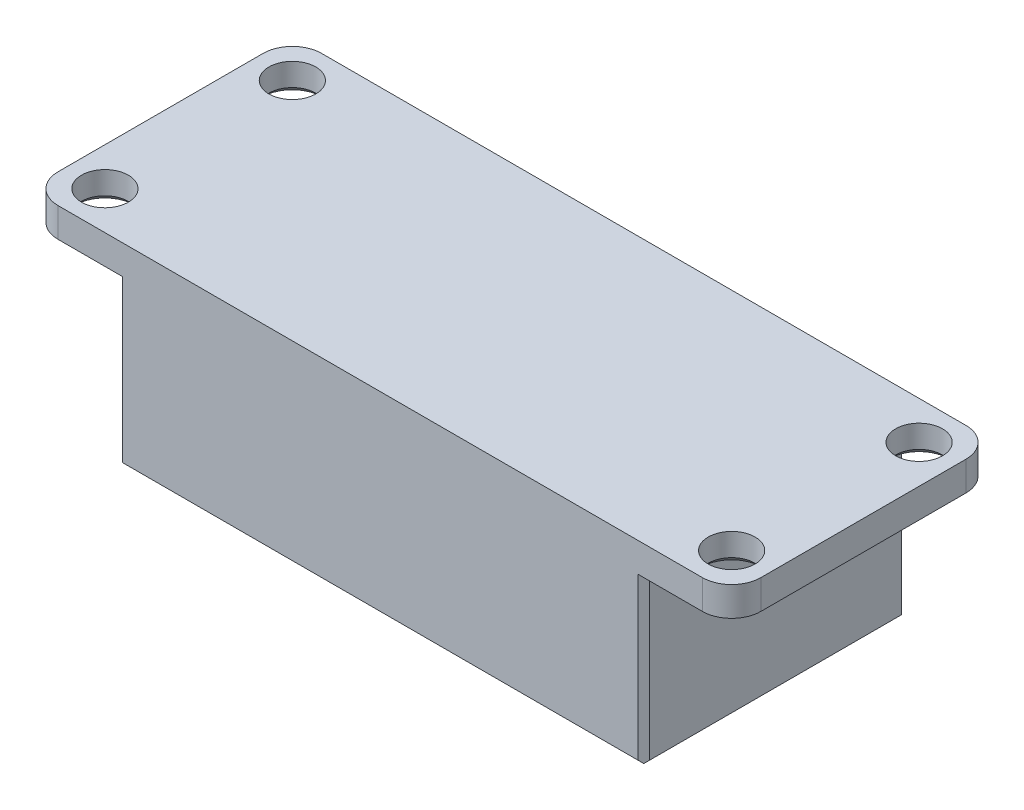
ISO-10303-21;
HEADER;
FILE_DESCRIPTION(('STEP AP214'),'2;1');
FILE_NAME('part.step','',(''),(''),'','','');
FILE_SCHEMA(('AUTOMOTIVE_DESIGN { 1 0 10303 214 1 1 1 1 }'));
ENDSEC;
DATA;
#1=APPLICATION_CONTEXT('core data for automotive mechanical design processes');
#2=APPLICATION_PROTOCOL_DEFINITION('international standard','automotive_design',2000,#1);
#3=PRODUCT_CONTEXT('',#1,'mechanical');
#4=PRODUCT('Part','Part','',(#3));
#5=PRODUCT_RELATED_PRODUCT_CATEGORY('part','',(#4));
#6=PRODUCT_DEFINITION_FORMATION('','',#4);
#7=PRODUCT_DEFINITION_CONTEXT('part definition',#1,'design');
#8=PRODUCT_DEFINITION('design','',#6,#7);
#9=PRODUCT_DEFINITION_SHAPE('','',#8);
#10=(LENGTH_UNIT() NAMED_UNIT(*) SI_UNIT(.MILLI.,.METRE.));
#11=(NAMED_UNIT(*) PLANE_ANGLE_UNIT() SI_UNIT($,.RADIAN.));
#12=(NAMED_UNIT(*) SI_UNIT($,.STERADIAN.) SOLID_ANGLE_UNIT());
#13=UNCERTAINTY_MEASURE_WITH_UNIT(LENGTH_MEASURE(1.E-05),#10,'distance_accuracy_value','');
#14=(GEOMETRIC_REPRESENTATION_CONTEXT(3) GLOBAL_UNCERTAINTY_ASSIGNED_CONTEXT((#13)) GLOBAL_UNIT_ASSIGNED_CONTEXT((#10,
#11,#12)) REPRESENTATION_CONTEXT('',''));
#15=CARTESIAN_POINT('',(0.,0.,0.));
#16=DIRECTION('',(0.,0.,1.));
#17=DIRECTION('',(1.,0.,0.));
#18=AXIS2_PLACEMENT_3D('',#15,#16,#17);
#19=CARTESIAN_POINT('',(-9.,6.,-4.5));
#20=DIRECTION('',(1.,0.,0.));
#21=DIRECTION('',(0.,0.,-1.));
#22=AXIS2_PLACEMENT_3D('',#19,#20,#21);
#23=PLANE('',#22);
#24=DIRECTION('',(0.,0.,1.));
#25=VECTOR('',#24,1.);
#26=CARTESIAN_POINT('',(-9.,6.,-4.5));
#27=LINE('',#26,#25);
#28=CARTESIAN_POINT('',(-9.,6.,-4.3));
#29=VERTEX_POINT('',#28);
#30=CARTESIAN_POINT('',(-9.,6.,4.3));
#31=VERTEX_POINT('',#30);
#32=EDGE_CURVE('E208',#29,#31,#27,.T.);
#33=ORIENTED_EDGE('',*,*,#32,.F.);
#34=DIRECTION('',(0.,-1.,0.));
#35=VECTOR('',#34,1.);
#36=CARTESIAN_POINT('',(-9.,0.500000000000007,-4.3));
#37=LINE('',#36,#35);
#38=CARTESIAN_POINT('',(-9.,0.500000000000007,-4.3));
#39=VERTEX_POINT('',#38);
#40=EDGE_CURVE('E269',#29,#39,#37,.T.);
#41=ORIENTED_EDGE('',*,*,#40,.T.);
#42=DIRECTION('',(0.,0.,1.));
#43=VECTOR('',#42,1.);
#44=CARTESIAN_POINT('',(-9.,0.500000000000007,-4.5));
#45=LINE('',#44,#43);
#46=CARTESIAN_POINT('',(-9.,0.500000000000007,4.3));
#47=VERTEX_POINT('',#46);
#48=EDGE_CURVE('E253',#39,#47,#45,.T.);
#49=ORIENTED_EDGE('',*,*,#48,.T.);
#50=DIRECTION('',(0.,1.,0.));
#51=VECTOR('',#50,1.);
#52=CARTESIAN_POINT('',(-9.,6.,4.3));
#53=LINE('',#52,#51);
#54=EDGE_CURVE('E256',#47,#31,#53,.T.);
#55=ORIENTED_EDGE('',*,*,#54,.T.);
#56=EDGE_LOOP('',(#33,#41,#49,#55));
#57=FACE_BOUND('',#56,.T.);
#58=ADVANCED_FACE('F36',(#57),#23,.F.);
#59=CARTESIAN_POINT('',(-9.,6.,4.5));
#60=DIRECTION('',(0.,0.,-1.));
#61=DIRECTION('',(-1.,0.,0.));
#62=AXIS2_PLACEMENT_3D('',#59,#60,#61);
#63=PLANE('',#62);
#64=DIRECTION('',(1.,0.,0.));
#65=VECTOR('',#64,1.);
#66=CARTESIAN_POINT('',(12.,6.,4.5));
#67=LINE('',#66,#65);
#68=CARTESIAN_POINT('',(-11.,6.,4.5));
#69=VERTEX_POINT('',#68);
#70=CARTESIAN_POINT('',(-8.8,6.,4.5));
#71=VERTEX_POINT('',#70);
#72=EDGE_CURVE('E309',#69,#71,#67,.T.);
#73=ORIENTED_EDGE('',*,*,#72,.T.);
#74=DIRECTION('',(0.,-1.,0.));
#75=VECTOR('',#74,1.);
#76=CARTESIAN_POINT('',(-8.8,6.,4.5));
#77=LINE('',#76,#75);
#78=CARTESIAN_POINT('',(-8.8,0.500000000000007,4.5));
#79=VERTEX_POINT('',#78);
#80=EDGE_CURVE('E287',#71,#79,#77,.T.);
#81=ORIENTED_EDGE('',*,*,#80,.T.);
#82=DIRECTION('',(1.,0.,0.));
#83=VECTOR('',#82,1.);
#84=CARTESIAN_POINT('',(-9.,0.500000000000007,4.5));
#85=LINE('',#84,#83);
#86=CARTESIAN_POINT('',(8.8,0.500000000000007,4.5));
#87=VERTEX_POINT('',#86);
#88=EDGE_CURVE('E236',#79,#87,#85,.T.);
#89=ORIENTED_EDGE('',*,*,#88,.T.);
#90=DIRECTION('',(0.,1.,0.));
#91=VECTOR('',#90,1.);
#92=CARTESIAN_POINT('',(8.8,6.,4.5));
#93=LINE('',#92,#91);
#94=CARTESIAN_POINT('',(8.8,6.,4.5));
#95=VERTEX_POINT('',#94);
#96=EDGE_CURVE('E284',#87,#95,#93,.T.);
#97=ORIENTED_EDGE('',*,*,#96,.T.);
#98=CARTESIAN_POINT('',(11.,6.,4.5));
#99=VERTEX_POINT('',#98);
#100=EDGE_CURVE('E329',#95,#99,#67,.T.);
#101=ORIENTED_EDGE('',*,*,#100,.T.);
#102=DIRECTION('',(0.,-1.,0.));
#103=VECTOR('',#102,1.);
#104=CARTESIAN_POINT('',(11.,6.,4.5));
#105=LINE('',#104,#103);
#106=CARTESIAN_POINT('',(11.,7.,4.5));
#107=VERTEX_POINT('',#106);
#108=EDGE_CURVE('E185',#99,#107,#105,.F.);
#109=ORIENTED_EDGE('',*,*,#108,.T.);
#110=DIRECTION('',(1.,0.,0.));
#111=VECTOR('',#110,1.);
#112=CARTESIAN_POINT('',(12.,7.,4.5));
#113=LINE('',#112,#111);
#114=CARTESIAN_POINT('',(-11.,7.,4.5));
#115=VERTEX_POINT('',#114);
#116=EDGE_CURVE('E344',#115,#107,#113,.T.);
#117=ORIENTED_EDGE('',*,*,#116,.F.);
#118=DIRECTION('',(0.,-1.,0.));
#119=VECTOR('',#118,1.);
#120=CARTESIAN_POINT('',(-11.,6.,4.5));
#121=LINE('',#120,#119);
#122=EDGE_CURVE('E227',#115,#69,#121,.T.);
#123=ORIENTED_EDGE('',*,*,#122,.T.);
#124=EDGE_LOOP('',(#73,#81,#89,#97,#101,#109,#117,#123));
#125=FACE_BOUND('',#124,.T.);
#126=ADVANCED_FACE('F317',(#125),#63,.F.);
#127=CARTESIAN_POINT('',(9.,6.,-4.5));
#128=DIRECTION('',(1.,0.,0.));
#129=DIRECTION('',(0.,0.,-1.));
#130=AXIS2_PLACEMENT_3D('',#127,#128,#129);
#131=PLANE('',#130);
#132=DIRECTION('',(0.,0.,1.));
#133=VECTOR('',#132,1.);
#134=CARTESIAN_POINT('',(9.,6.,-4.5));
#135=LINE('',#134,#133);
#136=CARTESIAN_POINT('',(9.,6.,-4.3));
#137=VERTEX_POINT('',#136);
#138=CARTESIAN_POINT('',(9.,6.,4.3));
#139=VERTEX_POINT('',#138);
#140=EDGE_CURVE('E203',#137,#139,#135,.T.);
#141=ORIENTED_EDGE('',*,*,#140,.T.);
#142=DIRECTION('',(0.,-1.,0.));
#143=VECTOR('',#142,1.);
#144=CARTESIAN_POINT('',(9.,0.500000000000007,4.3));
#145=LINE('',#144,#143);
#146=CARTESIAN_POINT('',(9.,0.500000000000007,4.3));
#147=VERTEX_POINT('',#146);
#148=EDGE_CURVE('E295',#139,#147,#145,.T.);
#149=ORIENTED_EDGE('',*,*,#148,.T.);
#150=DIRECTION('',(0.,0.,-1.));
#151=VECTOR('',#150,1.);
#152=CARTESIAN_POINT('',(9.,0.500000000000007,-4.5));
#153=LINE('',#152,#151);
#154=CARTESIAN_POINT('',(9.,0.500000000000007,-4.3));
#155=VERTEX_POINT('',#154);
#156=EDGE_CURVE('E249',#147,#155,#153,.T.);
#157=ORIENTED_EDGE('',*,*,#156,.T.);
#158=DIRECTION('',(0.,1.,0.));
#159=VECTOR('',#158,1.);
#160=CARTESIAN_POINT('',(9.,6.,-4.3));
#161=LINE('',#160,#159);
#162=EDGE_CURVE('E57',#155,#137,#161,.T.);
#163=ORIENTED_EDGE('',*,*,#162,.T.);
#164=EDGE_LOOP('',(#141,#149,#157,#163));
#165=FACE_BOUND('',#164,.T.);
#166=ADVANCED_FACE('F430',(#165),#131,.T.);
#167=CARTESIAN_POINT('',(-9.,6.,-4.5));
#168=DIRECTION('',(0.,0.,-1.));
#169=DIRECTION('',(-1.,0.,0.));
#170=AXIS2_PLACEMENT_3D('',#167,#168,#169);
#171=PLANE('',#170);
#172=DIRECTION('',(-1.,0.,0.));
#173=VECTOR('',#172,1.);
#174=CARTESIAN_POINT('',(-9.,0.500000000000007,-4.5));
#175=LINE('',#174,#173);
#176=CARTESIAN_POINT('',(8.8,0.500000000000007,-4.5));
#177=VERTEX_POINT('',#176);
#178=CARTESIAN_POINT('',(-8.8,0.500000000000007,-4.5));
#179=VERTEX_POINT('',#178);
#180=EDGE_CURVE('E251',#177,#179,#175,.T.);
#181=ORIENTED_EDGE('',*,*,#180,.T.);
#182=DIRECTION('',(0.,1.,0.));
#183=VECTOR('',#182,1.);
#184=CARTESIAN_POINT('',(-8.8,6.,-4.5));
#185=LINE('',#184,#183);
#186=CARTESIAN_POINT('',(-8.8,6.,-4.5));
#187=VERTEX_POINT('',#186);
#188=EDGE_CURVE('E194',#179,#187,#185,.T.);
#189=ORIENTED_EDGE('',*,*,#188,.T.);
#190=DIRECTION('',(-1.,0.,0.));
#191=VECTOR('',#190,1.);
#192=CARTESIAN_POINT('',(12.,6.,-4.5));
#193=LINE('',#192,#191);
#194=CARTESIAN_POINT('',(-11.,6.,-4.5));
#195=VERTEX_POINT('',#194);
#196=EDGE_CURVE('E176',#187,#195,#193,.T.);
#197=ORIENTED_EDGE('',*,*,#196,.T.);
#198=DIRECTION('',(0.,-1.,0.));
#199=VECTOR('',#198,1.);
#200=CARTESIAN_POINT('',(-11.,7.,-4.5));
#201=LINE('',#200,#199);
#202=CARTESIAN_POINT('',(-11.,7.,-4.5));
#203=VERTEX_POINT('',#202);
#204=EDGE_CURVE('E191',#195,#203,#201,.F.);
#205=ORIENTED_EDGE('',*,*,#204,.T.);
#206=DIRECTION('',(-1.,0.,0.));
#207=VECTOR('',#206,1.);
#208=CARTESIAN_POINT('',(12.,7.,-4.5));
#209=LINE('',#208,#207);
#210=CARTESIAN_POINT('',(11.,7.,-4.5));
#211=VERTEX_POINT('',#210);
#212=EDGE_CURVE('E350',#211,#203,#209,.T.);
#213=ORIENTED_EDGE('',*,*,#212,.F.);
#214=DIRECTION('',(0.,-1.,0.));
#215=VECTOR('',#214,1.);
#216=CARTESIAN_POINT('',(11.,6.,-4.5));
#217=LINE('',#216,#215);
#218=CARTESIAN_POINT('',(11.,6.,-4.5));
#219=VERTEX_POINT('',#218);
#220=EDGE_CURVE('E202',#211,#219,#217,.T.);
#221=ORIENTED_EDGE('',*,*,#220,.T.);
#222=CARTESIAN_POINT('',(8.8,6.,-4.5));
#223=VERTEX_POINT('',#222);
#224=EDGE_CURVE('E196',#219,#223,#193,.T.);
#225=ORIENTED_EDGE('',*,*,#224,.T.);
#226=DIRECTION('',(0.,-1.,0.));
#227=VECTOR('',#226,1.);
#228=CARTESIAN_POINT('',(8.8,6.,-4.5));
#229=LINE('',#228,#227);
#230=EDGE_CURVE('E280',#223,#177,#229,.T.);
#231=ORIENTED_EDGE('',*,*,#230,.T.);
#232=EDGE_LOOP('',(#181,#189,#197,#205,#213,#221,#225,#231));
#233=FACE_BOUND('',#232,.T.);
#234=ADVANCED_FACE('F189',(#233),#171,.T.);
#235=CARTESIAN_POINT('',(0.,0.,0.));
#236=DIRECTION('',(0.,1.,0.));
#237=DIRECTION('',(0.,0.,1.));
#238=AXIS2_PLACEMENT_3D('',#235,#236,#237);
#239=PLANE('',#238);
#240=DIRECTION('',(0.,0.,1.));
#241=VECTOR('',#240,1.);
#242=CARTESIAN_POINT('',(8.49999999999999,0.,4.5));
#243=LINE('',#242,#241);
#244=CARTESIAN_POINT('',(8.49999999999999,0.,-3.99999999999999));
#245=VERTEX_POINT('',#244);
#246=CARTESIAN_POINT('',(8.49999999999999,0.,3.99999999999999));
#247=VERTEX_POINT('',#246);
#248=EDGE_CURVE('E244',#245,#247,#243,.T.);
#249=ORIENTED_EDGE('',*,*,#248,.T.);
#250=DIRECTION('',(-1.,0.,0.));
#251=VECTOR('',#250,1.);
#252=CARTESIAN_POINT('',(0.,0.,3.99999999999999));
#253=LINE('',#252,#251);
#254=CARTESIAN_POINT('',(-8.49999999999999,0.,3.99999999999999));
#255=VERTEX_POINT('',#254);
#256=EDGE_CURVE('E246',#247,#255,#253,.T.);
#257=ORIENTED_EDGE('',*,*,#256,.T.);
#258=DIRECTION('',(0.,0.,-1.));
#259=VECTOR('',#258,1.);
#260=CARTESIAN_POINT('',(-8.49999999999999,0.,0.));
#261=LINE('',#260,#259);
#262=CARTESIAN_POINT('',(-8.49999999999999,0.,-3.99999999999999));
#263=VERTEX_POINT('',#262);
#264=EDGE_CURVE('E239',#255,#263,#261,.T.);
#265=ORIENTED_EDGE('',*,*,#264,.T.);
#266=DIRECTION('',(1.,0.,0.));
#267=VECTOR('',#266,1.);
#268=CARTESIAN_POINT('',(9.,0.,-3.99999999999999));
#269=LINE('',#268,#267);
#270=EDGE_CURVE('E242',#263,#245,#269,.T.);
#271=ORIENTED_EDGE('',*,*,#270,.T.);
#272=EDGE_LOOP('',(#249,#257,#265,#271));
#273=FACE_BOUND('',#272,.T.);
#274=ADVANCED_FACE('F490',(#273),#239,.F.);
#275=CARTESIAN_POINT('',(0.,6.,0.));
#276=DIRECTION('',(0.,-1.,0.));
#277=DIRECTION('',(0.,0.,-1.));
#278=AXIS2_PLACEMENT_3D('',#275,#276,#277);
#279=PLANE('',#278);
#280=CARTESIAN_POINT('',(10.7,6.,3.2));
#281=DIRECTION('',(0.,-1.,0.));
#282=DIRECTION('',(0.,0.,-1.));
#283=AXIS2_PLACEMENT_3D('',#280,#281,#282);
#284=CIRCLE('',#283,1.025);
#285=CARTESIAN_POINT('',(10.7,6.,2.175));
#286=VERTEX_POINT('',#285);
#287=EDGE_CURVE('E377',#286,#286,#284,.T.);
#288=ORIENTED_EDGE('',*,*,#287,.F.);
#289=EDGE_LOOP('',(#288));
#290=FACE_BOUND('',#289,.T.);
#291=CARTESIAN_POINT('',(10.7,6.,-3.2));
#292=DIRECTION('',(0.,-1.,0.));
#293=DIRECTION('',(0.,0.,-1.));
#294=AXIS2_PLACEMENT_3D('',#291,#292,#293);
#295=CIRCLE('',#294,1.025);
#296=CARTESIAN_POINT('',(10.7,6.,-4.225));
#297=VERTEX_POINT('',#296);
#298=EDGE_CURVE('E368',#297,#297,#295,.T.);
#299=ORIENTED_EDGE('',*,*,#298,.F.);
#300=EDGE_LOOP('',(#299));
#301=FACE_BOUND('',#300,.T.);
#302=ORIENTED_EDGE('',*,*,#224,.F.);
#303=CARTESIAN_POINT('',(11.,6.,-3.5));
#304=DIRECTION('',(0.,-1.,0.));
#305=DIRECTION('',(0.,0.,-1.));
#306=AXIS2_PLACEMENT_3D('',#303,#304,#305);
#307=CIRCLE('',#306,1.);
#308=CARTESIAN_POINT('',(12.,6.,-3.5));
#309=VERTEX_POINT('',#308);
#310=EDGE_CURVE('E213',#219,#309,#307,.T.);
#311=ORIENTED_EDGE('',*,*,#310,.T.);
#312=DIRECTION('',(0.,0.,-1.));
#313=VECTOR('',#312,1.);
#314=CARTESIAN_POINT('',(12.,6.,-4.5));
#315=LINE('',#314,#313);
#316=CARTESIAN_POINT('',(12.,6.,3.5));
#317=VERTEX_POINT('',#316);
#318=EDGE_CURVE('E197',#317,#309,#315,.T.);
#319=ORIENTED_EDGE('',*,*,#318,.F.);
#320=CARTESIAN_POINT('',(11.,6.,3.5));
#321=DIRECTION('',(0.,-1.,0.));
#322=DIRECTION('',(0.,0.,-1.));
#323=AXIS2_PLACEMENT_3D('',#320,#321,#322);
#324=CIRCLE('',#323,1.);
#325=EDGE_CURVE('E206',#317,#99,#324,.T.);
#326=ORIENTED_EDGE('',*,*,#325,.T.);
#327=ORIENTED_EDGE('',*,*,#100,.F.);
#328=DIRECTION('',(0.707106781186544,0.,-0.707106781186551));
#329=VECTOR('',#328,1.);
#330=CARTESIAN_POINT('',(9.,6.,4.3));
#331=LINE('',#330,#329);
#332=EDGE_CURVE('E44',#95,#139,#331,.T.);
#333=ORIENTED_EDGE('',*,*,#332,.T.);
#334=ORIENTED_EDGE('',*,*,#140,.F.);
#335=DIRECTION('',(0.707106781186548,0.,0.707106781186548));
#336=VECTOR('',#335,1.);
#337=CARTESIAN_POINT('',(8.8,6.,-4.5));
#338=LINE('',#337,#336);
#339=EDGE_CURVE('E11',#137,#223,#338,.F.);
#340=ORIENTED_EDGE('',*,*,#339,.T.);
#341=EDGE_LOOP('',(#302,#311,#319,#326,#327,#333,#334,#340));
#342=FACE_BOUND('',#341,.T.);
#343=ADVANCED_FACE('F405',(#290,#301,#342),#279,.T.);
#344=CARTESIAN_POINT('',(-12.,7.,-4.5));
#345=DIRECTION('',(1.,0.,0.));
#346=DIRECTION('',(0.,0.,-1.));
#347=AXIS2_PLACEMENT_3D('',#344,#345,#346);
#348=PLANE('',#347);
#349=DIRECTION('',(0.,0.,1.));
#350=VECTOR('',#349,1.);
#351=CARTESIAN_POINT('',(-12.,6.,-4.5));
#352=LINE('',#351,#350);
#353=CARTESIAN_POINT('',(-12.,6.,-3.5));
#354=VERTEX_POINT('',#353);
#355=CARTESIAN_POINT('',(-12.,6.,3.5));
#356=VERTEX_POINT('',#355);
#357=EDGE_CURVE('E179',#354,#356,#352,.T.);
#358=ORIENTED_EDGE('',*,*,#357,.T.);
#359=DIRECTION('',(0.,-1.,0.));
#360=VECTOR('',#359,1.);
#361=CARTESIAN_POINT('',(-12.,7.,3.5));
#362=LINE('',#361,#360);
#363=CARTESIAN_POINT('',(-12.,7.,3.5));
#364=VERTEX_POINT('',#363);
#365=EDGE_CURVE('E234',#356,#364,#362,.F.);
#366=ORIENTED_EDGE('',*,*,#365,.T.);
#367=DIRECTION('',(0.,0.,1.));
#368=VECTOR('',#367,1.);
#369=CARTESIAN_POINT('',(-12.,7.,-4.5));
#370=LINE('',#369,#368);
#371=CARTESIAN_POINT('',(-12.,7.,-3.5));
#372=VERTEX_POINT('',#371);
#373=EDGE_CURVE('E353',#372,#364,#370,.T.);
#374=ORIENTED_EDGE('',*,*,#373,.F.);
#375=DIRECTION('',(0.,-1.,0.));
#376=VECTOR('',#375,1.);
#377=CARTESIAN_POINT('',(-12.,6.,-3.5));
#378=LINE('',#377,#376);
#379=EDGE_CURVE('E232',#372,#354,#378,.T.);
#380=ORIENTED_EDGE('',*,*,#379,.T.);
#381=EDGE_LOOP('',(#358,#366,#374,#380));
#382=FACE_BOUND('',#381,.T.);
#383=ADVANCED_FACE('F497',(#382),#348,.F.);
#384=CARTESIAN_POINT('',(12.,7.,-4.5));
#385=DIRECTION('',(-1.,0.,0.));
#386=DIRECTION('',(0.,0.,1.));
#387=AXIS2_PLACEMENT_3D('',#384,#385,#386);
#388=PLANE('',#387);
#389=ORIENTED_EDGE('',*,*,#318,.T.);
#390=DIRECTION('',(0.,-1.,0.));
#391=VECTOR('',#390,1.);
#392=CARTESIAN_POINT('',(12.,7.,-3.5));
#393=LINE('',#392,#391);
#394=CARTESIAN_POINT('',(12.,7.,-3.5));
#395=VERTEX_POINT('',#394);
#396=EDGE_CURVE('E218',#309,#395,#393,.F.);
#397=ORIENTED_EDGE('',*,*,#396,.T.);
#398=DIRECTION('',(0.,0.,-1.));
#399=VECTOR('',#398,1.);
#400=CARTESIAN_POINT('',(12.,7.,-4.5));
#401=LINE('',#400,#399);
#402=CARTESIAN_POINT('',(12.,7.,3.5));
#403=VERTEX_POINT('',#402);
#404=EDGE_CURVE('E342',#403,#395,#401,.T.);
#405=ORIENTED_EDGE('',*,*,#404,.F.);
#406=DIRECTION('',(0.,-1.,0.));
#407=VECTOR('',#406,1.);
#408=CARTESIAN_POINT('',(12.,7.,3.5));
#409=LINE('',#408,#407);
#410=EDGE_CURVE('E215',#403,#317,#409,.T.);
#411=ORIENTED_EDGE('',*,*,#410,.T.);
#412=EDGE_LOOP('',(#389,#397,#405,#411));
#413=FACE_BOUND('',#412,.T.);
#414=ADVANCED_FACE('F347',(#413),#388,.F.);
#415=CARTESIAN_POINT('',(0.,7.,0.));
#416=DIRECTION('',(0.,-1.,0.));
#417=DIRECTION('',(0.,0.,-1.));
#418=AXIS2_PLACEMENT_3D('',#415,#416,#417);
#419=PLANE('',#418);
#420=CARTESIAN_POINT('',(-10.7,7.,-3.2));
#421=DIRECTION('',(0.,-1.,0.));
#422=DIRECTION('',(0.,0.,-1.));
#423=AXIS2_PLACEMENT_3D('',#420,#421,#422);
#424=CIRCLE('',#423,0.799999999999994);
#425=CARTESIAN_POINT('',(-10.7,7.,-4.));
#426=VERTEX_POINT('',#425);
#427=EDGE_CURVE('E389',#426,#426,#424,.T.);
#428=ORIENTED_EDGE('',*,*,#427,.T.);
#429=EDGE_LOOP('',(#428));
#430=FACE_BOUND('',#429,.T.);
#431=CARTESIAN_POINT('',(-10.7,7.,3.2));
#432=DIRECTION('',(0.,-1.,0.));
#433=DIRECTION('',(0.,0.,-1.));
#434=AXIS2_PLACEMENT_3D('',#431,#432,#433);
#435=CIRCLE('',#434,0.799999999999994);
#436=CARTESIAN_POINT('',(-10.7,7.,2.40000000000001));
#437=VERTEX_POINT('',#436);
#438=EDGE_CURVE('E380',#437,#437,#435,.T.);
#439=ORIENTED_EDGE('',*,*,#438,.T.);
#440=EDGE_LOOP('',(#439));
#441=FACE_BOUND('',#440,.T.);
#442=CARTESIAN_POINT('',(10.7,7.,3.2));
#443=DIRECTION('',(0.,-1.,0.));
#444=DIRECTION('',(0.,0.,-1.));
#445=AXIS2_PLACEMENT_3D('',#442,#443,#444);
#446=CIRCLE('',#445,0.799999999999994);
#447=CARTESIAN_POINT('',(10.7,7.,2.40000000000001));
#448=VERTEX_POINT('',#447);
#449=EDGE_CURVE('E371',#448,#448,#446,.T.);
#450=ORIENTED_EDGE('',*,*,#449,.T.);
#451=EDGE_LOOP('',(#450));
#452=FACE_BOUND('',#451,.T.);
#453=CARTESIAN_POINT('',(10.7,7.,-3.2));
#454=DIRECTION('',(0.,-1.,0.));
#455=DIRECTION('',(0.,0.,-1.));
#456=AXIS2_PLACEMENT_3D('',#453,#454,#455);
#457=CIRCLE('',#456,0.799999999999994);
#458=CARTESIAN_POINT('',(10.7,7.,-4.));
#459=VERTEX_POINT('',#458);
#460=EDGE_CURVE('E261',#459,#459,#457,.T.);
#461=ORIENTED_EDGE('',*,*,#460,.T.);
#462=EDGE_LOOP('',(#461));
#463=FACE_BOUND('',#462,.T.);
#464=ORIENTED_EDGE('',*,*,#404,.T.);
#465=CARTESIAN_POINT('',(11.,7.,-3.5));
#466=DIRECTION('',(0.,-1.,0.));
#467=DIRECTION('',(0.,0.,-1.));
#468=AXIS2_PLACEMENT_3D('',#465,#466,#467);
#469=CIRCLE('',#468,1.);
#470=EDGE_CURVE('E225',#395,#211,#469,.F.);
#471=ORIENTED_EDGE('',*,*,#470,.T.);
#472=ORIENTED_EDGE('',*,*,#212,.T.);
#473=CARTESIAN_POINT('',(-11.,7.,-3.5));
#474=DIRECTION('',(0.,-1.,0.));
#475=DIRECTION('',(0.,0.,-1.));
#476=AXIS2_PLACEMENT_3D('',#473,#474,#475);
#477=CIRCLE('',#476,1.);
#478=EDGE_CURVE('E201',#203,#372,#477,.F.);
#479=ORIENTED_EDGE('',*,*,#478,.T.);
#480=ORIENTED_EDGE('',*,*,#373,.T.);
#481=CARTESIAN_POINT('',(-11.,7.,3.5));
#482=DIRECTION('',(0.,-1.,0.));
#483=DIRECTION('',(0.,0.,-1.));
#484=AXIS2_PLACEMENT_3D('',#481,#482,#483);
#485=CIRCLE('',#484,1.);
#486=EDGE_CURVE('E221',#364,#115,#485,.F.);
#487=ORIENTED_EDGE('',*,*,#486,.T.);
#488=ORIENTED_EDGE('',*,*,#116,.T.);
#489=CARTESIAN_POINT('',(11.,7.,3.5));
#490=DIRECTION('',(0.,-1.,0.));
#491=DIRECTION('',(0.,0.,-1.));
#492=AXIS2_PLACEMENT_3D('',#489,#490,#491);
#493=CIRCLE('',#492,1.);
#494=EDGE_CURVE('E223',#107,#403,#493,.F.);
#495=ORIENTED_EDGE('',*,*,#494,.T.);
#496=EDGE_LOOP('',(#464,#471,#472,#479,#480,#487,#488,#495));
#497=FACE_BOUND('',#496,.T.);
#498=ADVANCED_FACE('F341',(#430,#441,#452,#463,#497),#419,.F.);
#499=CARTESIAN_POINT('',(-10.7,6.,-3.2));
#500=DIRECTION('',(0.,-1.,0.));
#501=DIRECTION('',(0.,0.,-1.));
#502=AXIS2_PLACEMENT_3D('',#499,#500,#501);
#503=CIRCLE('',#502,1.025);
#504=CARTESIAN_POINT('',(-10.7,6.,-4.225));
#505=VERTEX_POINT('',#504);
#506=EDGE_CURVE('E395',#505,#505,#503,.T.);
#507=ORIENTED_EDGE('',*,*,#506,.F.);
#508=EDGE_LOOP('',(#507));
#509=FACE_BOUND('',#508,.T.);
#510=CARTESIAN_POINT('',(-10.7,6.,3.2));
#511=DIRECTION('',(0.,-1.,0.));
#512=DIRECTION('',(0.,0.,-1.));
#513=AXIS2_PLACEMENT_3D('',#510,#511,#512);
#514=CIRCLE('',#513,1.025);
#515=CARTESIAN_POINT('',(-10.7,6.,2.175));
#516=VERTEX_POINT('',#515);
#517=EDGE_CURVE('E386',#516,#516,#514,.T.);
#518=ORIENTED_EDGE('',*,*,#517,.F.);
#519=EDGE_LOOP('',(#518));
#520=FACE_BOUND('',#519,.T.);
#521=ORIENTED_EDGE('',*,*,#72,.F.);
#522=CARTESIAN_POINT('',(-11.,6.,3.5));
#523=DIRECTION('',(0.,-1.,0.));
#524=DIRECTION('',(0.,0.,-1.));
#525=AXIS2_PLACEMENT_3D('',#522,#523,#524);
#526=CIRCLE('',#525,1.);
#527=EDGE_CURVE('E184',#69,#356,#526,.T.);
#528=ORIENTED_EDGE('',*,*,#527,.T.);
#529=ORIENTED_EDGE('',*,*,#357,.F.);
#530=CARTESIAN_POINT('',(-11.,6.,-3.5));
#531=DIRECTION('',(0.,-1.,0.));
#532=DIRECTION('',(0.,0.,-1.));
#533=AXIS2_PLACEMENT_3D('',#530,#531,#532);
#534=CIRCLE('',#533,1.);
#535=EDGE_CURVE('E172',#354,#195,#534,.T.);
#536=ORIENTED_EDGE('',*,*,#535,.T.);
#537=ORIENTED_EDGE('',*,*,#196,.F.);
#538=DIRECTION('',(-0.707106781186548,0.,0.707106781186548));
#539=VECTOR('',#538,1.);
#540=CARTESIAN_POINT('',(-9.,6.,-4.3));
#541=LINE('',#540,#539);
#542=EDGE_CURVE('E302',#187,#29,#541,.T.);
#543=ORIENTED_EDGE('',*,*,#542,.T.);
#544=ORIENTED_EDGE('',*,*,#32,.T.);
#545=DIRECTION('',(-0.707106781186554,0.,-0.707106781186541));
#546=VECTOR('',#545,1.);
#547=CARTESIAN_POINT('',(-8.8,6.,4.5));
#548=LINE('',#547,#546);
#549=EDGE_CURVE('E304',#31,#71,#548,.F.);
#550=ORIENTED_EDGE('',*,*,#549,.T.);
#551=EDGE_LOOP('',(#521,#528,#529,#536,#537,#543,#544,#550));
#552=FACE_BOUND('',#551,.T.);
#553=ADVANCED_FACE('F175',(#509,#520,#552),#279,.T.);
#554=CARTESIAN_POINT('',(11.,6.,-3.5));
#555=DIRECTION('',(0.,1.,0.));
#556=DIRECTION('',(0.,0.,1.));
#557=AXIS2_PLACEMENT_3D('',#554,#555,#556);
#558=CYLINDRICAL_SURFACE('',#557,1.);
#559=ORIENTED_EDGE('',*,*,#470,.F.);
#560=ORIENTED_EDGE('',*,*,#396,.F.);
#561=ORIENTED_EDGE('',*,*,#310,.F.);
#562=ORIENTED_EDGE('',*,*,#220,.F.);
#563=EDGE_LOOP('',(#559,#560,#561,#562));
#564=FACE_BOUND('',#563,.T.);
#565=ADVANCED_FACE('F403',(#564),#558,.T.);
#566=CARTESIAN_POINT('',(11.,7.,3.5));
#567=DIRECTION('',(0.,-1.,0.));
#568=DIRECTION('',(0.,0.,-1.));
#569=AXIS2_PLACEMENT_3D('',#566,#567,#568);
#570=CYLINDRICAL_SURFACE('',#569,1.);
#571=ORIENTED_EDGE('',*,*,#494,.F.);
#572=ORIENTED_EDGE('',*,*,#108,.F.);
#573=ORIENTED_EDGE('',*,*,#325,.F.);
#574=ORIENTED_EDGE('',*,*,#410,.F.);
#575=EDGE_LOOP('',(#571,#572,#573,#574));
#576=FACE_BOUND('',#575,.T.);
#577=ADVANCED_FACE('F336',(#576),#570,.T.);
#578=CARTESIAN_POINT('',(-11.,6.,3.5));
#579=DIRECTION('',(0.,-1.,0.));
#580=DIRECTION('',(0.,0.,-1.));
#581=AXIS2_PLACEMENT_3D('',#578,#579,#580);
#582=CYLINDRICAL_SURFACE('',#581,1.);
#583=ORIENTED_EDGE('',*,*,#486,.F.);
#584=ORIENTED_EDGE('',*,*,#365,.F.);
#585=ORIENTED_EDGE('',*,*,#527,.F.);
#586=ORIENTED_EDGE('',*,*,#122,.F.);
#587=EDGE_LOOP('',(#583,#584,#585,#586));
#588=FACE_BOUND('',#587,.T.);
#589=ADVANCED_FACE('F439',(#588),#582,.T.);
#590=CARTESIAN_POINT('',(-11.,7.,-3.5));
#591=DIRECTION('',(0.,1.,0.));
#592=DIRECTION('',(0.,0.,1.));
#593=AXIS2_PLACEMENT_3D('',#590,#591,#592);
#594=CYLINDRICAL_SURFACE('',#593,1.);
#595=ORIENTED_EDGE('',*,*,#478,.F.);
#596=ORIENTED_EDGE('',*,*,#204,.F.);
#597=ORIENTED_EDGE('',*,*,#535,.F.);
#598=ORIENTED_EDGE('',*,*,#379,.F.);
#599=EDGE_LOOP('',(#595,#596,#597,#598));
#600=FACE_BOUND('',#599,.T.);
#601=ADVANCED_FACE('F200',(#600),#594,.T.);
#602=CARTESIAN_POINT('',(0.,0.,-3.99999999999999));
#603=DIRECTION('',(0.,-0.707106781186547,-0.707106781186547));
#604=DIRECTION('',(-1.,0.,0.));
#605=AXIS2_PLACEMENT_3D('',#602,#603,#604);
#606=PLANE('',#605);
#607=DIRECTION('',(-0.577350269189626,0.577350269189626,-0.577350269189626));
#608=VECTOR('',#607,1.);
#609=CARTESIAN_POINT('',(-9.,0.500000000000007,-4.5));
#610=LINE('',#609,#608);
#611=CARTESIAN_POINT('',(-8.9,0.400000000000008,-4.4));
#612=VERTEX_POINT('',#611);
#613=EDGE_CURVE('E266',#612,#263,#610,.F.);
#614=ORIENTED_EDGE('',*,*,#613,.F.);
#615=DIRECTION('',(0.577350269189626,0.577350269189626,-0.577350269189626));
#616=VECTOR('',#615,1.);
#617=CARTESIAN_POINT('',(-6.20000000000001,3.1,-7.1));
#618=LINE('',#617,#616);
#619=EDGE_CURVE('E278',#612,#179,#618,.T.);
#620=ORIENTED_EDGE('',*,*,#619,.T.);
#621=ORIENTED_EDGE('',*,*,#180,.F.);
#622=DIRECTION('',(-0.577350269189626,0.577350269189626,-0.577350269189626));
#623=VECTOR('',#622,1.);
#624=CARTESIAN_POINT('',(6.20000000000001,3.1,-7.1));
#625=LINE('',#624,#623);
#626=CARTESIAN_POINT('',(8.9,0.40000000000001,-4.4));
#627=VERTEX_POINT('',#626);
#628=EDGE_CURVE('E276',#177,#627,#625,.F.);
#629=ORIENTED_EDGE('',*,*,#628,.T.);
#630=DIRECTION('',(-0.577350269189625,-0.577350269189626,0.577350269189626));
#631=VECTOR('',#630,1.);
#632=CARTESIAN_POINT('',(5.66666666666667,-2.83333333333333,-1.16666666666666));
#633=LINE('',#632,#631);
#634=EDGE_CURVE('E263',#245,#627,#633,.F.);
#635=ORIENTED_EDGE('',*,*,#634,.F.);
#636=ORIENTED_EDGE('',*,*,#270,.F.);
#637=EDGE_LOOP('',(#614,#620,#621,#629,#635,#636));
#638=FACE_BOUND('',#637,.T.);
#639=ADVANCED_FACE('F445',(#638),#606,.T.);
#640=CARTESIAN_POINT('',(-9.,0.500000000000007,-4.5));
#641=DIRECTION('',(0.707106781186547,0.707106781186547,0.));
#642=DIRECTION('',(0.,0.,1.));
#643=AXIS2_PLACEMENT_3D('',#640,#641,#642);
#644=PLANE('',#643);
#645=ORIENTED_EDGE('',*,*,#48,.F.);
#646=DIRECTION('',(-0.577350269189626,0.577350269189626,0.577350269189626));
#647=VECTOR('',#646,1.);
#648=CARTESIAN_POINT('',(-8.93333333333334,0.433333333333341,-4.36666666666667));
#649=LINE('',#648,#647);
#650=EDGE_CURVE('E274',#39,#612,#649,.F.);
#651=ORIENTED_EDGE('',*,*,#650,.T.);
#652=ORIENTED_EDGE('',*,*,#613,.T.);
#653=ORIENTED_EDGE('',*,*,#264,.F.);
#654=DIRECTION('',(-0.577350269189626,0.577350269189626,0.577350269189626));
#655=VECTOR('',#654,1.);
#656=CARTESIAN_POINT('',(-6.,-2.49999999999999,1.5));
#657=LINE('',#656,#655);
#658=CARTESIAN_POINT('',(-8.9,0.400000000000007,4.4));
#659=VERTEX_POINT('',#658);
#660=EDGE_CURVE('E260',#659,#255,#657,.F.);
#661=ORIENTED_EDGE('',*,*,#660,.F.);
#662=DIRECTION('',(-0.577350269189629,0.577350269189629,-0.577350269189619));
#663=VECTOR('',#662,1.);
#664=CARTESIAN_POINT('',(-11.9333333333333,3.43333333333332,1.36666666666673));
#665=LINE('',#664,#663);
#666=EDGE_CURVE('E272',#659,#47,#665,.T.);
#667=ORIENTED_EDGE('',*,*,#666,.T.);
#668=EDGE_LOOP('',(#645,#651,#652,#653,#661,#667));
#669=FACE_BOUND('',#668,.T.);
#670=ADVANCED_FACE('F452',(#669),#644,.F.);
#671=CARTESIAN_POINT('',(8.49999999999999,0.,0.));
#672=DIRECTION('',(0.707106781186548,-0.707106781186547,0.));
#673=DIRECTION('',(0.,0.,-1.));
#674=AXIS2_PLACEMENT_3D('',#671,#672,#673);
#675=PLANE('',#674);
#676=ORIENTED_EDGE('',*,*,#156,.F.);
#677=DIRECTION('',(-0.577350269189624,-0.577350269189625,0.577350269189629));
#678=VECTOR('',#677,1.);
#679=CARTESIAN_POINT('',(10.1,1.60000000000001,3.19999999999999));
#680=LINE('',#679,#678);
#681=CARTESIAN_POINT('',(8.9,0.400000000000007,4.4));
#682=VERTEX_POINT('',#681);
#683=EDGE_CURVE('E300',#147,#682,#680,.T.);
#684=ORIENTED_EDGE('',*,*,#683,.T.);
#685=DIRECTION('',(0.577350269189625,0.577350269189626,0.577350269189626));
#686=VECTOR('',#685,1.);
#687=CARTESIAN_POINT('',(7.16666666666666,-1.33333333333333,2.66666666666666));
#688=LINE('',#687,#686);
#689=EDGE_CURVE('E257',#247,#682,#688,.T.);
#690=ORIENTED_EDGE('',*,*,#689,.F.);
#691=ORIENTED_EDGE('',*,*,#248,.F.);
#692=ORIENTED_EDGE('',*,*,#634,.T.);
#693=DIRECTION('',(-0.577350269189626,-0.577350269189626,-0.577350269189625));
#694=VECTOR('',#693,1.);
#695=CARTESIAN_POINT('',(10.1,1.6,-3.20000000000001));
#696=LINE('',#695,#694);
#697=EDGE_CURVE('E298',#627,#155,#696,.F.);
#698=ORIENTED_EDGE('',*,*,#697,.T.);
#699=EDGE_LOOP('',(#676,#684,#690,#691,#692,#698));
#700=FACE_BOUND('',#699,.T.);
#701=ADVANCED_FACE('F449',(#700),#675,.T.);
#702=CARTESIAN_POINT('',(-9.,0.500000000000007,4.5));
#703=DIRECTION('',(0.,0.707106781186547,-0.707106781186547));
#704=DIRECTION('',(1.,0.,0.));
#705=AXIS2_PLACEMENT_3D('',#702,#703,#704);
#706=PLANE('',#705);
#707=ORIENTED_EDGE('',*,*,#88,.F.);
#708=DIRECTION('',(-0.577350269189632,-0.577350269189622,-0.577350269189622));
#709=VECTOR('',#708,1.);
#710=CARTESIAN_POINT('',(-8.86666666666667,0.43333333333334,4.43333333333333));
#711=LINE('',#710,#709);
#712=EDGE_CURVE('E292',#79,#659,#711,.T.);
#713=ORIENTED_EDGE('',*,*,#712,.T.);
#714=ORIENTED_EDGE('',*,*,#660,.T.);
#715=ORIENTED_EDGE('',*,*,#256,.F.);
#716=ORIENTED_EDGE('',*,*,#689,.T.);
#717=DIRECTION('',(0.577350269189622,-0.577350269189627,-0.577350269189627));
#718=VECTOR('',#717,1.);
#719=CARTESIAN_POINT('',(2.86666666666673,6.43333333333332,10.4333333333333));
#720=LINE('',#719,#718);
#721=EDGE_CURVE('E290',#682,#87,#720,.F.);
#722=ORIENTED_EDGE('',*,*,#721,.T.);
#723=EDGE_LOOP('',(#707,#713,#714,#715,#716,#722));
#724=FACE_BOUND('',#723,.T.);
#725=ADVANCED_FACE('F320',(#724),#706,.F.);
#726=CARTESIAN_POINT('',(-9.,6.,-4.3));
#727=DIRECTION('',(-0.707106781186548,0.,-0.707106781186548));
#728=DIRECTION('',(0.,1.,0.));
#729=AXIS2_PLACEMENT_3D('',#726,#727,#728);
#730=PLANE('',#729);
#731=ORIENTED_EDGE('',*,*,#542,.F.);
#732=ORIENTED_EDGE('',*,*,#188,.F.);
#733=ORIENTED_EDGE('',*,*,#619,.F.);
#734=ORIENTED_EDGE('',*,*,#650,.F.);
#735=ORIENTED_EDGE('',*,*,#40,.F.);
#736=EDGE_LOOP('',(#731,#732,#733,#734,#735));
#737=FACE_BOUND('',#736,.T.);
#738=ADVANCED_FACE('F448',(#737),#730,.T.);
#739=CARTESIAN_POINT('',(-8.8,6.,4.5));
#740=DIRECTION('',(0.707106781186541,0.,-0.707106781186554));
#741=DIRECTION('',(0.,-1.,0.));
#742=AXIS2_PLACEMENT_3D('',#739,#740,#741);
#743=PLANE('',#742);
#744=ORIENTED_EDGE('',*,*,#549,.F.);
#745=ORIENTED_EDGE('',*,*,#54,.F.);
#746=ORIENTED_EDGE('',*,*,#666,.F.);
#747=ORIENTED_EDGE('',*,*,#712,.F.);
#748=ORIENTED_EDGE('',*,*,#80,.F.);
#749=EDGE_LOOP('',(#744,#745,#746,#747,#748));
#750=FACE_BOUND('',#749,.T.);
#751=ADVANCED_FACE('F313',(#750),#743,.F.);
#752=CARTESIAN_POINT('',(9.,6.,4.3));
#753=DIRECTION('',(0.707106781186551,0.,0.707106781186544));
#754=DIRECTION('',(0.,1.,0.));
#755=AXIS2_PLACEMENT_3D('',#752,#753,#754);
#756=PLANE('',#755);
#757=ORIENTED_EDGE('',*,*,#332,.F.);
#758=ORIENTED_EDGE('',*,*,#96,.F.);
#759=ORIENTED_EDGE('',*,*,#721,.F.);
#760=ORIENTED_EDGE('',*,*,#683,.F.);
#761=ORIENTED_EDGE('',*,*,#148,.F.);
#762=EDGE_LOOP('',(#757,#758,#759,#760,#761));
#763=FACE_BOUND('',#762,.T.);
#764=ADVANCED_FACE('F326',(#763),#756,.T.);
#765=CARTESIAN_POINT('',(8.8,6.,-4.5));
#766=DIRECTION('',(-0.707106781186547,0.,0.707106781186547));
#767=DIRECTION('',(0.,-1.,0.));
#768=AXIS2_PLACEMENT_3D('',#765,#766,#767);
#769=PLANE('',#768);
#770=ORIENTED_EDGE('',*,*,#339,.F.);
#771=ORIENTED_EDGE('',*,*,#162,.F.);
#772=ORIENTED_EDGE('',*,*,#697,.F.);
#773=ORIENTED_EDGE('',*,*,#628,.F.);
#774=ORIENTED_EDGE('',*,*,#230,.F.);
#775=EDGE_LOOP('',(#770,#771,#772,#773,#774));
#776=FACE_BOUND('',#775,.T.);
#777=ADVANCED_FACE('F38',(#776),#769,.F.);
#778=CARTESIAN_POINT('',(10.7,6.,-3.2));
#779=DIRECTION('',(0.,-1.,0.));
#780=DIRECTION('',(0.,0.,-1.));
#781=AXIS2_PLACEMENT_3D('',#778,#779,#780);
#782=CYLINDRICAL_SURFACE('',#781,0.799999999999994);
#783=ORIENTED_EDGE('',*,*,#460,.F.);
#784=EDGE_LOOP('',(#783));
#785=FACE_BOUND('',#784,.T.);
#786=CARTESIAN_POINT('',(10.7,6.225,-3.2));
#787=DIRECTION('',(0.,-1.,0.));
#788=DIRECTION('',(0.,0.,-1.));
#789=AXIS2_PLACEMENT_3D('',#786,#787,#788);
#790=CIRCLE('',#789,0.799999999999988);
#791=CARTESIAN_POINT('',(10.7,6.225,-3.99999999999999));
#792=VERTEX_POINT('',#791);
#793=EDGE_CURVE('E365',#792,#792,#790,.T.);
#794=ORIENTED_EDGE('',*,*,#793,.T.);
#795=EDGE_LOOP('',(#794));
#796=FACE_BOUND('',#795,.T.);
#797=ADVANCED_FACE('F468',(#785,#796),#782,.F.);
#798=CARTESIAN_POINT('',(10.7,6.,-3.2));
#799=DIRECTION('',(0.,-1.,0.));
#800=DIRECTION('',(0.,0.,-1.));
#801=AXIS2_PLACEMENT_3D('',#798,#799,#800);
#802=CONICAL_SURFACE('',#801,1.025,0.785398163397464);
#803=ORIENTED_EDGE('',*,*,#793,.F.);
#804=EDGE_LOOP('',(#803));
#805=FACE_BOUND('',#804,.T.);
#806=ORIENTED_EDGE('',*,*,#298,.T.);
#807=EDGE_LOOP('',(#806));
#808=FACE_BOUND('',#807,.T.);
#809=ADVANCED_FACE('F473',(#805,#808),#802,.F.);
#810=CARTESIAN_POINT('',(10.7,6.,3.2));
#811=DIRECTION('',(0.,-1.,0.));
#812=DIRECTION('',(0.,0.,-1.));
#813=AXIS2_PLACEMENT_3D('',#810,#811,#812);
#814=CYLINDRICAL_SURFACE('',#813,0.799999999999994);
#815=ORIENTED_EDGE('',*,*,#449,.F.);
#816=EDGE_LOOP('',(#815));
#817=FACE_BOUND('',#816,.T.);
#818=CARTESIAN_POINT('',(10.7,6.225,3.2));
#819=DIRECTION('',(0.,-1.,0.));
#820=DIRECTION('',(0.,0.,-1.));
#821=AXIS2_PLACEMENT_3D('',#818,#819,#820);
#822=CIRCLE('',#821,0.799999999999988);
#823=CARTESIAN_POINT('',(10.7,6.225,2.40000000000001));
#824=VERTEX_POINT('',#823);
#825=EDGE_CURVE('E374',#824,#824,#822,.T.);
#826=ORIENTED_EDGE('',*,*,#825,.T.);
#827=EDGE_LOOP('',(#826));
#828=FACE_BOUND('',#827,.T.);
#829=ADVANCED_FACE('F601',(#817,#828),#814,.F.);
#830=CARTESIAN_POINT('',(10.7,6.,3.2));
#831=DIRECTION('',(0.,-1.,0.));
#832=DIRECTION('',(0.,0.,-1.));
#833=AXIS2_PLACEMENT_3D('',#830,#831,#832);
#834=CONICAL_SURFACE('',#833,1.025,0.785398163397464);
#835=ORIENTED_EDGE('',*,*,#825,.F.);
#836=EDGE_LOOP('',(#835));
#837=FACE_BOUND('',#836,.T.);
#838=ORIENTED_EDGE('',*,*,#287,.T.);
#839=EDGE_LOOP('',(#838));
#840=FACE_BOUND('',#839,.T.);
#841=ADVANCED_FACE('F420',(#837,#840),#834,.F.);
#842=CARTESIAN_POINT('',(-10.7,6.,3.2));
#843=DIRECTION('',(0.,-1.,0.));
#844=DIRECTION('',(0.,0.,-1.));
#845=AXIS2_PLACEMENT_3D('',#842,#843,#844);
#846=CYLINDRICAL_SURFACE('',#845,0.799999999999994);
#847=ORIENTED_EDGE('',*,*,#438,.F.);
#848=EDGE_LOOP('',(#847));
#849=FACE_BOUND('',#848,.T.);
#850=CARTESIAN_POINT('',(-10.7,6.225,3.2));
#851=DIRECTION('',(0.,-1.,0.));
#852=DIRECTION('',(0.,0.,-1.));
#853=AXIS2_PLACEMENT_3D('',#850,#851,#852);
#854=CIRCLE('',#853,0.799999999999988);
#855=CARTESIAN_POINT('',(-10.7,6.225,2.40000000000001));
#856=VERTEX_POINT('',#855);
#857=EDGE_CURVE('E383',#856,#856,#854,.T.);
#858=ORIENTED_EDGE('',*,*,#857,.T.);
#859=EDGE_LOOP('',(#858));
#860=FACE_BOUND('',#859,.T.);
#861=ADVANCED_FACE('F411',(#849,#860),#846,.F.);
#862=CARTESIAN_POINT('',(-10.7,6.,3.2));
#863=DIRECTION('',(0.,-1.,0.));
#864=DIRECTION('',(0.,0.,-1.));
#865=AXIS2_PLACEMENT_3D('',#862,#863,#864);
#866=CONICAL_SURFACE('',#865,1.025,0.785398163397464);
#867=ORIENTED_EDGE('',*,*,#857,.F.);
#868=EDGE_LOOP('',(#867));
#869=FACE_BOUND('',#868,.T.);
#870=ORIENTED_EDGE('',*,*,#517,.T.);
#871=EDGE_LOOP('',(#870));
#872=FACE_BOUND('',#871,.T.);
#873=ADVANCED_FACE('F408',(#869,#872),#866,.F.);
#874=CARTESIAN_POINT('',(-10.7,6.,-3.2));
#875=DIRECTION('',(0.,-1.,0.));
#876=DIRECTION('',(0.,0.,-1.));
#877=AXIS2_PLACEMENT_3D('',#874,#875,#876);
#878=CYLINDRICAL_SURFACE('',#877,0.799999999999994);
#879=ORIENTED_EDGE('',*,*,#427,.F.);
#880=EDGE_LOOP('',(#879));
#881=FACE_BOUND('',#880,.T.);
#882=CARTESIAN_POINT('',(-10.7,6.225,-3.2));
#883=DIRECTION('',(0.,-1.,0.));
#884=DIRECTION('',(0.,0.,-1.));
#885=AXIS2_PLACEMENT_3D('',#882,#883,#884);
#886=CIRCLE('',#885,0.799999999999988);
#887=CARTESIAN_POINT('',(-10.7,6.225,-3.99999999999999));
#888=VERTEX_POINT('',#887);
#889=EDGE_CURVE('E392',#888,#888,#886,.T.);
#890=ORIENTED_EDGE('',*,*,#889,.T.);
#891=EDGE_LOOP('',(#890));
#892=FACE_BOUND('',#891,.T.);
#893=ADVANCED_FACE('F410',(#881,#892),#878,.F.);
#894=CARTESIAN_POINT('',(-10.7,6.,-3.2));
#895=DIRECTION('',(0.,-1.,0.));
#896=DIRECTION('',(0.,0.,-1.));
#897=AXIS2_PLACEMENT_3D('',#894,#895,#896);
#898=CONICAL_SURFACE('',#897,1.025,0.785398163397464);
#899=ORIENTED_EDGE('',*,*,#889,.F.);
#900=EDGE_LOOP('',(#899));
#901=FACE_BOUND('',#900,.T.);
#902=ORIENTED_EDGE('',*,*,#506,.T.);
#903=EDGE_LOOP('',(#902));
#904=FACE_BOUND('',#903,.T.);
#905=ADVANCED_FACE('F399',(#901,#904),#898,.F.);
#906=CLOSED_SHELL('',(#58,#126,#166,#234,#274,#343,#383,#414,#498,#553,#565,#577,#589,#601,#639,
#670,#701,#725,#738,#751,#764,#777,#797,#809,#829,#841,#861,#873,#893,#905));
#907=MANIFOLD_SOLID_BREP('B2',#906);
#908=ADVANCED_BREP_SHAPE_REPRESENTATION('',(#18,#907),#14);
#909=SHAPE_DEFINITION_REPRESENTATION(#9,#908);
ENDSEC;
END-ISO-10303-21;
